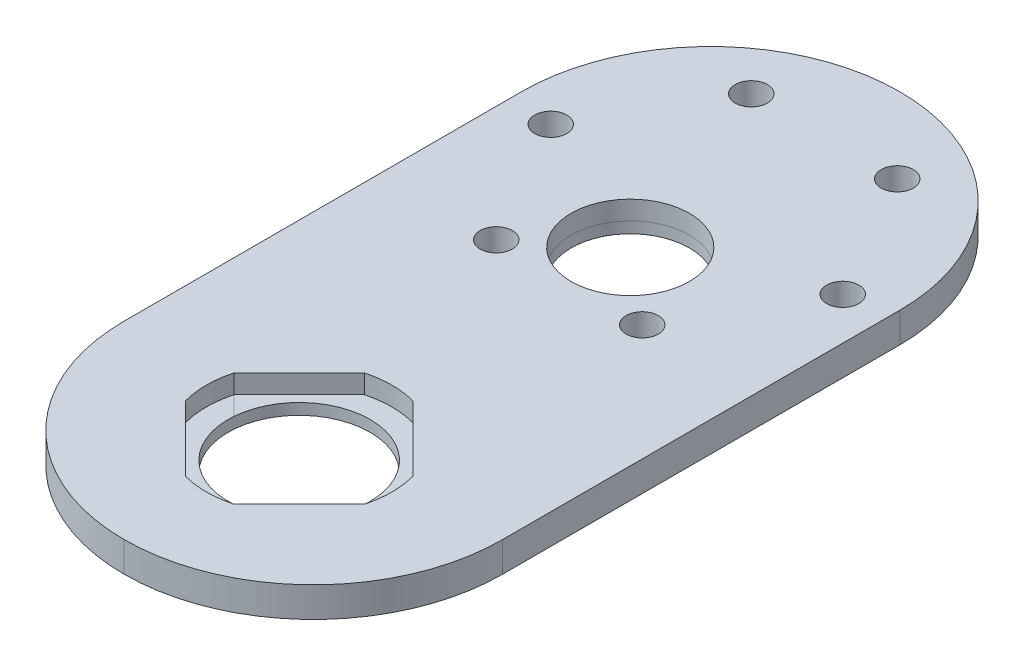
ISO-10303-21;
HEADER;
FILE_DESCRIPTION(('STEP AP214'),'2;1');
FILE_NAME('part.step','',(''),(''),'','','');
FILE_SCHEMA(('AUTOMOTIVE_DESIGN { 1 0 10303 214 1 1 1 1 }'));
ENDSEC;
DATA;
#1=APPLICATION_CONTEXT('core data for automotive mechanical design processes');
#2=APPLICATION_PROTOCOL_DEFINITION('international standard','automotive_design',2000,#1);
#3=PRODUCT_CONTEXT('',#1,'mechanical');
#4=PRODUCT('Part','Part','',(#3));
#5=PRODUCT_RELATED_PRODUCT_CATEGORY('part','',(#4));
#6=PRODUCT_DEFINITION_FORMATION('','',#4);
#7=PRODUCT_DEFINITION_CONTEXT('part definition',#1,'design');
#8=PRODUCT_DEFINITION('design','',#6,#7);
#9=PRODUCT_DEFINITION_SHAPE('','',#8);
#10=(LENGTH_UNIT() NAMED_UNIT(*) SI_UNIT(.MILLI.,.METRE.));
#11=(NAMED_UNIT(*) PLANE_ANGLE_UNIT() SI_UNIT($,.RADIAN.));
#12=(NAMED_UNIT(*) SI_UNIT($,.STERADIAN.) SOLID_ANGLE_UNIT());
#13=UNCERTAINTY_MEASURE_WITH_UNIT(LENGTH_MEASURE(1.E-05),#10,'distance_accuracy_value','');
#14=(GEOMETRIC_REPRESENTATION_CONTEXT(3) GLOBAL_UNCERTAINTY_ASSIGNED_CONTEXT((#13)) GLOBAL_UNIT_ASSIGNED_CONTEXT((#10,
#11,#12)) REPRESENTATION_CONTEXT('',''));
#15=CARTESIAN_POINT('',(0.,0.,0.));
#16=DIRECTION('',(0.,0.,1.));
#17=DIRECTION('',(1.,0.,0.));
#18=AXIS2_PLACEMENT_3D('',#15,#16,#17);
#19=CARTESIAN_POINT('',(0.,0.,0.));
#20=DIRECTION('',(0.,1.,0.));
#21=DIRECTION('',(0.,0.,1.));
#22=AXIS2_PLACEMENT_3D('',#19,#20,#21);
#23=PLANE('',#22);
#24=CARTESIAN_POINT('',(-33.1863924805896,0.,-17.3197798680824));
#25=DIRECTION('',(0.,-1.,0.));
#26=DIRECTION('',(0.,0.,-1.));
#27=AXIS2_PLACEMENT_3D('',#24,#25,#26);
#28=CIRCLE('',#27,1.69999999999999);
#29=CARTESIAN_POINT('',(-33.1863924805896,0.,-19.0197798680824));
#30=VERTEX_POINT('',#29);
#31=EDGE_CURVE('E210',#30,#30,#28,.T.);
#32=ORIENTED_EDGE('',*,*,#31,.T.);
#33=EDGE_LOOP('',(#32));
#34=FACE_BOUND('',#33,.T.);
#35=CARTESIAN_POINT('',(-40.9084819148407,0.,-23.7767003529734));
#36=DIRECTION('',(0.,1.,0.));
#37=DIRECTION('',(0.,0.,1.));
#38=AXIS2_PLACEMENT_3D('',#35,#36,#37);
#39=CIRCLE('',#38,6.25);
#40=CARTESIAN_POINT('',(-40.9084819148407,0.,-17.5267003529734));
#41=VERTEX_POINT('',#40);
#42=EDGE_CURVE('E165',#41,#41,#39,.T.);
#43=ORIENTED_EDGE('',*,*,#42,.F.);
#44=EDGE_LOOP('',(#43));
#45=FACE_BOUND('',#44,.T.);
#46=CARTESIAN_POINT('',(-40.9084819148407,0.,11.2232996470266));
#47=DIRECTION('',(0.,1.,0.));
#48=DIRECTION('',(0.,0.,1.));
#49=AXIS2_PLACEMENT_3D('',#46,#47,#48);
#50=CIRCLE('',#49,9.8);
#51=CARTESIAN_POINT('',(-50.3678024271225,0.,8.66180487913708));
#52=VERTEX_POINT('',#51);
#53=CARTESIAN_POINT('',(-50.3678024271225,0.,13.7847944149161));
#54=VERTEX_POINT('',#53);
#55=EDGE_CURVE('E230',#52,#54,#50,.T.);
#56=ORIENTED_EDGE('',*,*,#55,.F.);
#57=DIRECTION('',(-0.707106781186547,0.,0.707106781186548));
#58=VECTOR('',#57,1.);
#59=CARTESIAN_POINT('',(-43.4699766827303,0.,1.76397913474485));
#60=LINE('',#59,#58);
#61=CARTESIAN_POINT('',(-43.4699766827303,0.,1.76397913474485));
#62=VERTEX_POINT('',#61);
#63=EDGE_CURVE('E235',#62,#52,#60,.T.);
#64=ORIENTED_EDGE('',*,*,#63,.F.);
#65=CARTESIAN_POINT('',(-40.9084819148407,0.,11.2232996470266));
#66=DIRECTION('',(0.,1.,0.));
#67=DIRECTION('',(0.,0.,1.));
#68=AXIS2_PLACEMENT_3D('',#65,#66,#67);
#69=CIRCLE('',#68,9.80000000000001);
#70=CARTESIAN_POINT('',(-38.3469871469512,0.,1.76397913474484));
#71=VERTEX_POINT('',#70);
#72=EDGE_CURVE('E268',#71,#62,#69,.T.);
#73=ORIENTED_EDGE('',*,*,#72,.F.);
#74=DIRECTION('',(-0.707106781186548,0.,-0.707106781186547));
#75=VECTOR('',#74,1.);
#76=CARTESIAN_POINT('',(-31.4491614025589,0.,8.66180487913708));
#77=LINE('',#76,#75);
#78=CARTESIAN_POINT('',(-31.4491614025589,0.,8.66180487913708));
#79=VERTEX_POINT('',#78);
#80=EDGE_CURVE('E265',#79,#71,#77,.T.);
#81=ORIENTED_EDGE('',*,*,#80,.F.);
#82=CARTESIAN_POINT('',(-40.9084819148407,0.,11.2232996470266));
#83=DIRECTION('',(0.,1.,0.));
#84=DIRECTION('',(0.,0.,1.));
#85=AXIS2_PLACEMENT_3D('',#82,#83,#84);
#86=CIRCLE('',#85,9.80000000000001);
#87=CARTESIAN_POINT('',(-31.4491614025589,0.,13.7847944149161));
#88=VERTEX_POINT('',#87);
#89=EDGE_CURVE('E262',#88,#79,#86,.T.);
#90=ORIENTED_EDGE('',*,*,#89,.F.);
#91=DIRECTION('',(0.707106781186548,0.,-0.707106781186547));
#92=VECTOR('',#91,1.);
#93=CARTESIAN_POINT('',(-38.3469871469512,0.,20.6826201593084));
#94=LINE('',#93,#92);
#95=CARTESIAN_POINT('',(-38.3469871469512,0.,20.6826201593084));
#96=VERTEX_POINT('',#95);
#97=EDGE_CURVE('E259',#96,#88,#94,.T.);
#98=ORIENTED_EDGE('',*,*,#97,.F.);
#99=CARTESIAN_POINT('',(-40.9084819148407,0.,11.2232996470266));
#100=DIRECTION('',(0.,1.,0.));
#101=DIRECTION('',(0.,0.,1.));
#102=AXIS2_PLACEMENT_3D('',#99,#100,#101);
#103=CIRCLE('',#102,9.8);
#104=CARTESIAN_POINT('',(-43.4699766827303,0.,20.6826201593084));
#105=VERTEX_POINT('',#104);
#106=EDGE_CURVE('E256',#105,#96,#103,.T.);
#107=ORIENTED_EDGE('',*,*,#106,.F.);
#108=DIRECTION('',(0.707106781186547,0.,0.707106781186548));
#109=VECTOR('',#108,1.);
#110=CARTESIAN_POINT('',(-50.3678024271225,0.,13.7847944149162));
#111=LINE('',#110,#109);
#112=EDGE_CURVE('E253',#54,#105,#111,.T.);
#113=ORIENTED_EDGE('',*,*,#112,.F.);
#114=EDGE_LOOP('',(#56,#64,#73,#81,#90,#98,#107,#113));
#115=FACE_BOUND('',#114,.T.);
#116=CARTESIAN_POINT('',(-40.9084819148407,0.,-32.2767003529734));
#117=DIRECTION('',(0.,1.,0.));
#118=DIRECTION('',(0.,0.,1.));
#119=AXIS2_PLACEMENT_3D('',#116,#117,#118);
#120=CIRCLE('',#119,20.);
#121=CARTESIAN_POINT('',(-20.9084819148407,0.,-32.2767003529734));
#122=VERTEX_POINT('',#121);
#123=CARTESIAN_POINT('',(-40.9084819148407,0.,-52.2767003529734));
#124=VERTEX_POINT('',#123);
#125=EDGE_CURVE('E184',#122,#124,#120,.T.);
#126=ORIENTED_EDGE('',*,*,#125,.T.);
#127=CARTESIAN_POINT('',(-40.9084819148407,0.,-32.2767003529734));
#128=DIRECTION('',(0.,1.,0.));
#129=DIRECTION('',(0.,0.,1.));
#130=AXIS2_PLACEMENT_3D('',#127,#128,#129);
#131=CIRCLE('',#130,20.);
#132=CARTESIAN_POINT('',(-60.9084819148407,0.,-32.2767003529734));
#133=VERTEX_POINT('',#132);
#134=EDGE_CURVE('E186',#124,#133,#131,.T.);
#135=ORIENTED_EDGE('',*,*,#134,.T.);
#136=DIRECTION('',(0.,0.,1.));
#137=VECTOR('',#136,1.);
#138=CARTESIAN_POINT('',(-60.9084819148407,0.,-52.2767003529734));
#139=LINE('',#138,#137);
#140=CARTESIAN_POINT('',(-60.9084819148407,0.,9.72329964702663));
#141=VERTEX_POINT('',#140);
#142=EDGE_CURVE('E275',#133,#141,#139,.T.);
#143=ORIENTED_EDGE('',*,*,#142,.T.);
#144=CARTESIAN_POINT('',(-40.9084819148407,0.,9.72329964702663));
#145=DIRECTION('',(0.,1.,0.));
#146=DIRECTION('',(0.,0.,1.));
#147=AXIS2_PLACEMENT_3D('',#144,#145,#146);
#148=CIRCLE('',#147,20.);
#149=CARTESIAN_POINT('',(-40.9084819148407,0.,29.7232996470266));
#150=VERTEX_POINT('',#149);
#151=EDGE_CURVE('E156',#141,#150,#148,.T.);
#152=ORIENTED_EDGE('',*,*,#151,.T.);
#153=CARTESIAN_POINT('',(-40.9084819148407,0.,9.72329964702663));
#154=DIRECTION('',(0.,1.,0.));
#155=DIRECTION('',(0.,0.,1.));
#156=AXIS2_PLACEMENT_3D('',#153,#154,#155);
#157=CIRCLE('',#156,20.);
#158=CARTESIAN_POINT('',(-20.9084819148407,0.,9.72329964702663));
#159=VERTEX_POINT('',#158);
#160=EDGE_CURVE('E182',#150,#159,#157,.T.);
#161=ORIENTED_EDGE('',*,*,#160,.T.);
#162=DIRECTION('',(0.,0.,-1.));
#163=VECTOR('',#162,1.);
#164=CARTESIAN_POINT('',(-20.9084819148407,0.,-52.2767003529734));
#165=LINE('',#164,#163);
#166=EDGE_CURVE('E178',#159,#122,#165,.T.);
#167=ORIENTED_EDGE('',*,*,#166,.T.);
#168=EDGE_LOOP('',(#126,#135,#143,#152,#161,#167));
#169=FACE_BOUND('',#168,.T.);
#170=CARTESIAN_POINT('',(-25.3782907866334,0.,-30.7094605191226));
#171=DIRECTION('',(0.,-1.,0.));
#172=DIRECTION('',(0.,0.,-1.));
#173=AXIS2_PLACEMENT_3D('',#170,#171,#172);
#174=CIRCLE('',#173,1.69999999999999);
#175=CARTESIAN_POINT('',(-25.3782907866334,0.,-32.4094605191226));
#176=VERTEX_POINT('',#175);
#177=EDGE_CURVE('E220',#176,#176,#174,.T.);
#178=ORIENTED_EDGE('',*,*,#177,.T.);
#179=EDGE_LOOP('',(#178));
#180=FACE_BOUND('',#179,.T.);
#181=CARTESIAN_POINT('',(-33.0700435320169,0.,-44.1663152669411));
#182=DIRECTION('',(0.,-1.,0.));
#183=DIRECTION('',(0.,0.,-1.));
#184=AXIS2_PLACEMENT_3D('',#181,#182,#183);
#185=CIRCLE('',#184,1.69999999999999);
#186=CARTESIAN_POINT('',(-33.0700435320169,0.,-45.8663152669411));
#187=VERTEX_POINT('',#186);
#188=EDGE_CURVE('E597',#187,#187,#185,.T.);
#189=ORIENTED_EDGE('',*,*,#188,.T.);
#190=EDGE_LOOP('',(#189));
#191=FACE_BOUND('',#190,.T.);
#192=CARTESIAN_POINT('',(-48.6862469199294,0.,-17.3869539648608));
#193=DIRECTION('',(0.,-1.,0.));
#194=DIRECTION('',(0.,0.,-1.));
#195=AXIS2_PLACEMENT_3D('',#192,#193,#194);
#196=CIRCLE('',#195,1.69999999999999);
#197=CARTESIAN_POINT('',(-48.6862469199294,0.,-19.0869539648608));
#198=VERTEX_POINT('',#197);
#199=EDGE_CURVE('E591',#198,#198,#196,.T.);
#200=ORIENTED_EDGE('',*,*,#199,.T.);
#201=EDGE_LOOP('',(#200));
#202=FACE_BOUND('',#201,.T.);
#203=CARTESIAN_POINT('',(-48.5698979713568,0.,-44.2334893637194));
#204=DIRECTION('',(0.,-1.,0.));
#205=DIRECTION('',(0.,0.,-1.));
#206=AXIS2_PLACEMENT_3D('',#203,#204,#205);
#207=CIRCLE('',#206,1.69999999999999);
#208=CARTESIAN_POINT('',(-48.5698979713568,0.,-45.9334893637194));
#209=VERTEX_POINT('',#208);
#210=EDGE_CURVE('E585',#209,#209,#207,.T.);
#211=ORIENTED_EDGE('',*,*,#210,.T.);
#212=EDGE_LOOP('',(#211));
#213=FACE_BOUND('',#212,.T.);
#214=CARTESIAN_POINT('',(-56.377999665313,0.,-30.8438087126793));
#215=DIRECTION('',(0.,-1.,0.));
#216=DIRECTION('',(0.,0.,-1.));
#217=AXIS2_PLACEMENT_3D('',#214,#215,#216);
#218=CIRCLE('',#217,1.69999999999999);
#219=CARTESIAN_POINT('',(-56.377999665313,0.,-32.5438087126793));
#220=VERTEX_POINT('',#219);
#221=EDGE_CURVE('E576',#220,#220,#218,.T.);
#222=ORIENTED_EDGE('',*,*,#221,.T.);
#223=EDGE_LOOP('',(#222));
#224=FACE_BOUND('',#223,.T.);
#225=ADVANCED_FACE('F42',(#34,#45,#115,#169,#180,#191,#202,#213,#224),#23,.T.);
#226=CARTESIAN_POINT('',(-40.9084819148407,-2.,11.2232996470266));
#227=DIRECTION('',(0.,1.,0.));
#228=DIRECTION('',(0.,0.,1.));
#229=AXIS2_PLACEMENT_3D('',#226,#227,#228);
#230=PLANE('',#229);
#231=CARTESIAN_POINT('',(-40.9084819148407,-2.,11.2232996470266));
#232=DIRECTION('',(0.,1.,0.));
#233=DIRECTION('',(0.,0.,1.));
#234=AXIS2_PLACEMENT_3D('',#231,#232,#233);
#235=CIRCLE('',#234,7.5);
#236=CARTESIAN_POINT('',(-40.3287473713401,-2.,18.7008599349195));
#237=VERTEX_POINT('',#236);
#238=CARTESIAN_POINT('',(-48.3860422027336,-2.,10.643565103526));
#239=VERTEX_POINT('',#238);
#240=EDGE_CURVE('E152',#237,#239,#235,.T.);
#241=ORIENTED_EDGE('',*,*,#240,.F.);
#242=DIRECTION('',(0.707106781186547,0.,0.707106781186548));
#243=VECTOR('',#242,1.);
#244=CARTESIAN_POINT('',(-50.3678024271225,-2.,8.66180487913708));
#245=LINE('',#244,#243);
#246=CARTESIAN_POINT('',(-38.3469871469512,-2.,20.6826201593084));
#247=VERTEX_POINT('',#246);
#248=EDGE_CURVE('E162',#237,#247,#245,.T.);
#249=ORIENTED_EDGE('',*,*,#248,.T.);
#250=DIRECTION('',(0.707106781186548,0.,-0.707106781186547));
#251=VECTOR('',#250,1.);
#252=CARTESIAN_POINT('',(-38.3469871469512,-2.,20.6826201593084));
#253=LINE('',#252,#251);
#254=CARTESIAN_POINT('',(-31.4491614025589,-2.,13.7847944149161));
#255=VERTEX_POINT('',#254);
#256=EDGE_CURVE('E238',#247,#255,#253,.T.);
#257=ORIENTED_EDGE('',*,*,#256,.T.);
#258=CARTESIAN_POINT('',(-40.9084819148407,-2.,11.2232996470266));
#259=DIRECTION('',(0.,1.,0.));
#260=DIRECTION('',(0.,0.,1.));
#261=AXIS2_PLACEMENT_3D('',#258,#259,#260);
#262=CIRCLE('',#261,9.80000000000001);
#263=CARTESIAN_POINT('',(-31.4491614025589,-2.,8.66180487913708));
#264=VERTEX_POINT('',#263);
#265=EDGE_CURVE('E240',#255,#264,#262,.T.);
#266=ORIENTED_EDGE('',*,*,#265,.T.);
#267=DIRECTION('',(-0.707106781186548,0.,-0.707106781186547));
#268=VECTOR('',#267,1.);
#269=CARTESIAN_POINT('',(-31.4491614025589,-2.,8.66180487913708));
#270=LINE('',#269,#268);
#271=CARTESIAN_POINT('',(-38.3469871469512,-2.,1.76397913474484));
#272=VERTEX_POINT('',#271);
#273=EDGE_CURVE('E243',#264,#272,#270,.T.);
#274=ORIENTED_EDGE('',*,*,#273,.T.);
#275=CARTESIAN_POINT('',(-40.9084819148407,-2.,11.2232996470266));
#276=DIRECTION('',(0.,1.,0.));
#277=DIRECTION('',(0.,0.,1.));
#278=AXIS2_PLACEMENT_3D('',#275,#276,#277);
#279=CIRCLE('',#278,9.80000000000001);
#280=CARTESIAN_POINT('',(-43.4699766827303,-2.,1.76397913474485));
#281=VERTEX_POINT('',#280);
#282=EDGE_CURVE('E246',#272,#281,#279,.T.);
#283=ORIENTED_EDGE('',*,*,#282,.T.);
#284=DIRECTION('',(-0.707106781186547,0.,0.707106781186548));
#285=VECTOR('',#284,1.);
#286=CARTESIAN_POINT('',(-43.4699766827303,-2.,1.76397913474485));
#287=LINE('',#286,#285);
#288=CARTESIAN_POINT('',(-50.3678024271225,-2.,8.66180487913708));
#289=VERTEX_POINT('',#288);
#290=EDGE_CURVE('E249',#281,#289,#287,.T.);
#291=ORIENTED_EDGE('',*,*,#290,.T.);
#292=EDGE_CURVE('E157',#289,#239,#245,.T.);
#293=ORIENTED_EDGE('',*,*,#292,.T.);
#294=EDGE_LOOP('',(#241,#249,#257,#266,#274,#283,#291,#293));
#295=FACE_BOUND('',#294,.T.);
#296=ADVANCED_FACE('F160',(#295),#230,.T.);
#297=CARTESIAN_POINT('',(-60.9084819148407,-3.175,-52.2767003529734));
#298=DIRECTION('',(-1.,0.,0.));
#299=DIRECTION('',(0.,0.,1.));
#300=AXIS2_PLACEMENT_3D('',#297,#298,#299);
#301=PLANE('',#300);
#302=ORIENTED_EDGE('',*,*,#142,.F.);
#303=DIRECTION('',(0.,1.,0.));
#304=VECTOR('',#303,1.);
#305=CARTESIAN_POINT('',(-60.9084819148407,-3.175,-32.2767003529734));
#306=LINE('',#305,#304);
#307=CARTESIAN_POINT('',(-60.9084819148407,-3.175,-32.2767003529734));
#308=VERTEX_POINT('',#307);
#309=EDGE_CURVE('E190',#133,#308,#306,.F.);
#310=ORIENTED_EDGE('',*,*,#309,.T.);
#311=DIRECTION('',(0.,0.,1.));
#312=VECTOR('',#311,1.);
#313=CARTESIAN_POINT('',(-60.9084819148407,-3.175,-52.2767003529734));
#314=LINE('',#313,#312);
#315=CARTESIAN_POINT('',(-60.9084819148407,-3.175,9.72329964702663));
#316=VERTEX_POINT('',#315);
#317=EDGE_CURVE('E175',#308,#316,#314,.T.);
#318=ORIENTED_EDGE('',*,*,#317,.T.);
#319=DIRECTION('',(0.,1.,0.));
#320=VECTOR('',#319,1.);
#321=CARTESIAN_POINT('',(-60.9084819148407,-3.175,9.72329964702663));
#322=LINE('',#321,#320);
#323=EDGE_CURVE('E188',#316,#141,#322,.T.);
#324=ORIENTED_EDGE('',*,*,#323,.T.);
#325=EDGE_LOOP('',(#302,#310,#318,#324));
#326=FACE_BOUND('',#325,.T.);
#327=ADVANCED_FACE('F307',(#326),#301,.T.);
#328=CARTESIAN_POINT('',(-20.9084819148407,-3.175,-52.2767003529734));
#329=DIRECTION('',(1.,0.,0.));
#330=DIRECTION('',(0.,0.,-1.));
#331=AXIS2_PLACEMENT_3D('',#328,#329,#330);
#332=PLANE('',#331);
#333=DIRECTION('',(0.,0.,-1.));
#334=VECTOR('',#333,1.);
#335=CARTESIAN_POINT('',(-20.9084819148407,-3.175,-52.2767003529734));
#336=LINE('',#335,#334);
#337=CARTESIAN_POINT('',(-20.9084819148407,-3.175,9.72329964702663));
#338=VERTEX_POINT('',#337);
#339=CARTESIAN_POINT('',(-20.9084819148407,-3.175,-32.2767003529734));
#340=VERTEX_POINT('',#339);
#341=EDGE_CURVE('E173',#338,#340,#336,.T.);
#342=ORIENTED_EDGE('',*,*,#341,.T.);
#343=DIRECTION('',(0.,1.,0.));
#344=VECTOR('',#343,1.);
#345=CARTESIAN_POINT('',(-20.9084819148407,-3.175,-32.2767003529734));
#346=LINE('',#345,#344);
#347=EDGE_CURVE('E12',#340,#122,#346,.T.);
#348=ORIENTED_EDGE('',*,*,#347,.T.);
#349=ORIENTED_EDGE('',*,*,#166,.F.);
#350=DIRECTION('',(0.,1.,0.));
#351=VECTOR('',#350,1.);
#352=CARTESIAN_POINT('',(-20.9084819148407,-3.175,9.72329964702663));
#353=LINE('',#352,#351);
#354=EDGE_CURVE('E51',#159,#338,#353,.F.);
#355=ORIENTED_EDGE('',*,*,#354,.T.);
#356=EDGE_LOOP('',(#342,#348,#349,#355));
#357=FACE_BOUND('',#356,.T.);
#358=ADVANCED_FACE('F312',(#357),#332,.T.);
#359=CARTESIAN_POINT('',(0.,-3.175,0.));
#360=DIRECTION('',(0.,1.,0.));
#361=DIRECTION('',(0.,0.,1.));
#362=AXIS2_PLACEMENT_3D('',#359,#360,#361);
#363=PLANE('',#362);
#364=CARTESIAN_POINT('',(-56.377999665313,-3.175,-30.8438087126793));
#365=DIRECTION('',(0.,-1.,0.));
#366=DIRECTION('',(0.,0.,-1.));
#367=AXIS2_PLACEMENT_3D('',#364,#365,#366);
#368=CIRCLE('',#367,1.69999999999999);
#369=CARTESIAN_POINT('',(-56.377999665313,-3.175,-32.5438087126793));
#370=VERTEX_POINT('',#369);
#371=EDGE_CURVE('E578',#370,#370,#368,.T.);
#372=ORIENTED_EDGE('',*,*,#371,.F.);
#373=EDGE_LOOP('',(#372));
#374=FACE_BOUND('',#373,.T.);
#375=CARTESIAN_POINT('',(-48.5698979713568,-3.175,-44.2334893637194));
#376=DIRECTION('',(0.,-1.,0.));
#377=DIRECTION('',(0.,0.,-1.));
#378=AXIS2_PLACEMENT_3D('',#375,#376,#377);
#379=CIRCLE('',#378,1.69999999999999);
#380=CARTESIAN_POINT('',(-48.5698979713568,-3.175,-45.9334893637194));
#381=VERTEX_POINT('',#380);
#382=EDGE_CURVE('E580',#381,#381,#379,.T.);
#383=ORIENTED_EDGE('',*,*,#382,.F.);
#384=EDGE_LOOP('',(#383));
#385=FACE_BOUND('',#384,.T.);
#386=CARTESIAN_POINT('',(-48.6862469199294,-3.175,-17.3869539648608));
#387=DIRECTION('',(0.,-1.,0.));
#388=DIRECTION('',(0.,0.,-1.));
#389=AXIS2_PLACEMENT_3D('',#386,#387,#388);
#390=CIRCLE('',#389,1.69999999999999);
#391=CARTESIAN_POINT('',(-48.6862469199294,-3.175,-19.0869539648608));
#392=VERTEX_POINT('',#391);
#393=EDGE_CURVE('E588',#392,#392,#390,.T.);
#394=ORIENTED_EDGE('',*,*,#393,.F.);
#395=EDGE_LOOP('',(#394));
#396=FACE_BOUND('',#395,.T.);
#397=CARTESIAN_POINT('',(-33.0700435320169,-3.175,-44.1663152669411));
#398=DIRECTION('',(0.,-1.,0.));
#399=DIRECTION('',(0.,0.,-1.));
#400=AXIS2_PLACEMENT_3D('',#397,#398,#399);
#401=CIRCLE('',#400,1.69999999999999);
#402=CARTESIAN_POINT('',(-33.0700435320169,-3.175,-45.8663152669411));
#403=VERTEX_POINT('',#402);
#404=EDGE_CURVE('E594',#403,#403,#401,.T.);
#405=ORIENTED_EDGE('',*,*,#404,.F.);
#406=EDGE_LOOP('',(#405));
#407=FACE_BOUND('',#406,.T.);
#408=CARTESIAN_POINT('',(-25.3782907866334,-3.175,-30.7094605191226));
#409=DIRECTION('',(0.,-1.,0.));
#410=DIRECTION('',(0.,0.,-1.));
#411=AXIS2_PLACEMENT_3D('',#408,#409,#410);
#412=CIRCLE('',#411,1.69999999999999);
#413=CARTESIAN_POINT('',(-25.3782907866334,-3.175,-32.4094605191226));
#414=VERTEX_POINT('',#413);
#415=EDGE_CURVE('E600',#414,#414,#412,.T.);
#416=ORIENTED_EDGE('',*,*,#415,.F.);
#417=EDGE_LOOP('',(#416));
#418=FACE_BOUND('',#417,.T.);
#419=CARTESIAN_POINT('',(-33.1863924805896,-3.175,-17.3197798680824));
#420=DIRECTION('',(0.,-1.,0.));
#421=DIRECTION('',(0.,0.,-1.));
#422=AXIS2_PLACEMENT_3D('',#419,#420,#421);
#423=CIRCLE('',#422,1.69999999999999);
#424=CARTESIAN_POINT('',(-33.1863924805896,-3.175,-19.0197798680824));
#425=VERTEX_POINT('',#424);
#426=EDGE_CURVE('E215',#425,#425,#423,.T.);
#427=ORIENTED_EDGE('',*,*,#426,.F.);
#428=EDGE_LOOP('',(#427));
#429=FACE_BOUND('',#428,.T.);
#430=CARTESIAN_POINT('',(-40.9084819148407,-3.175,-23.7767003529734));
#431=DIRECTION('',(0.,-1.,0.));
#432=DIRECTION('',(0.,0.,-1.));
#433=AXIS2_PLACEMENT_3D('',#430,#431,#432);
#434=CIRCLE('',#433,6.25);
#435=CARTESIAN_POINT('',(-40.9084819148407,-3.175,-30.0267003529734));
#436=VERTEX_POINT('',#435);
#437=EDGE_CURVE('E202',#436,#436,#434,.T.);
#438=ORIENTED_EDGE('',*,*,#437,.F.);
#439=EDGE_LOOP('',(#438));
#440=FACE_BOUND('',#439,.T.);
#441=CARTESIAN_POINT('',(-40.9084819148407,-3.175,11.2232996470266));
#442=DIRECTION('',(0.,-1.,0.));
#443=DIRECTION('',(0.,0.,-1.));
#444=AXIS2_PLACEMENT_3D('',#441,#442,#443);
#445=CIRCLE('',#444,7.5);
#446=CARTESIAN_POINT('',(-40.9084819148407,-3.175,3.72329964702662));
#447=VERTEX_POINT('',#446);
#448=EDGE_CURVE('E166',#447,#447,#445,.T.);
#449=ORIENTED_EDGE('',*,*,#448,.F.);
#450=EDGE_LOOP('',(#449));
#451=FACE_BOUND('',#450,.T.);
#452=ORIENTED_EDGE('',*,*,#317,.F.);
#453=CARTESIAN_POINT('',(-40.9084819148407,-3.175,-32.2767003529734));
#454=DIRECTION('',(0.,1.,0.));
#455=DIRECTION('',(0.,0.,1.));
#456=AXIS2_PLACEMENT_3D('',#453,#454,#455);
#457=CIRCLE('',#456,20.);
#458=CARTESIAN_POINT('',(-40.9084819148407,-3.175,-52.2767003529734));
#459=VERTEX_POINT('',#458);
#460=EDGE_CURVE('E197',#308,#459,#457,.F.);
#461=ORIENTED_EDGE('',*,*,#460,.T.);
#462=CARTESIAN_POINT('',(-40.9084819148407,-3.175,-32.2767003529734));
#463=DIRECTION('',(0.,1.,0.));
#464=DIRECTION('',(0.,0.,1.));
#465=AXIS2_PLACEMENT_3D('',#462,#463,#464);
#466=CIRCLE('',#465,20.);
#467=EDGE_CURVE('E65',#459,#340,#466,.F.);
#468=ORIENTED_EDGE('',*,*,#467,.T.);
#469=ORIENTED_EDGE('',*,*,#341,.F.);
#470=CARTESIAN_POINT('',(-40.9084819148407,-3.175,9.72329964702663));
#471=DIRECTION('',(0.,1.,0.));
#472=DIRECTION('',(0.,0.,1.));
#473=AXIS2_PLACEMENT_3D('',#470,#471,#472);
#474=CIRCLE('',#473,20.);
#475=CARTESIAN_POINT('',(-40.9084819148407,-3.175,29.7232996470266));
#476=VERTEX_POINT('',#475);
#477=EDGE_CURVE('E59',#338,#476,#474,.F.);
#478=ORIENTED_EDGE('',*,*,#477,.T.);
#479=CARTESIAN_POINT('',(-40.9084819148407,-3.175,9.72329964702663));
#480=DIRECTION('',(0.,1.,0.));
#481=DIRECTION('',(0.,0.,1.));
#482=AXIS2_PLACEMENT_3D('',#479,#480,#481);
#483=CIRCLE('',#482,20.);
#484=EDGE_CURVE('E193',#476,#316,#483,.F.);
#485=ORIENTED_EDGE('',*,*,#484,.T.);
#486=EDGE_LOOP('',(#452,#461,#468,#469,#478,#485));
#487=FACE_BOUND('',#486,.T.);
#488=ADVANCED_FACE('F313',(#374,#385,#396,#407,#418,#429,#440,#451,#487),#363,.F.);
#489=CARTESIAN_POINT('',(-40.9084819148407,-2.,11.2232996470266));
#490=DIRECTION('',(0.,1.,0.));
#491=DIRECTION('',(0.,0.,1.));
#492=AXIS2_PLACEMENT_3D('',#489,#490,#491);
#493=CYLINDRICAL_SURFACE('',#492,9.8);
#494=ORIENTED_EDGE('',*,*,#55,.T.);
#495=DIRECTION('',(0.,1.,0.));
#496=VECTOR('',#495,1.);
#497=CARTESIAN_POINT('',(-50.3678024271225,-2.,13.7847944149162));
#498=LINE('',#497,#496);
#499=CARTESIAN_POINT('',(-50.3678024271225,-2.,13.7847944149162));
#500=VERTEX_POINT('',#499);
#501=EDGE_CURVE('E251',#500,#54,#498,.T.);
#502=ORIENTED_EDGE('',*,*,#501,.F.);
#503=CARTESIAN_POINT('',(-40.9084819148407,-2.,11.2232996470266));
#504=DIRECTION('',(0.,1.,0.));
#505=DIRECTION('',(0.,0.,1.));
#506=AXIS2_PLACEMENT_3D('',#503,#504,#505);
#507=CIRCLE('',#506,9.8);
#508=EDGE_CURVE('E231',#289,#500,#507,.T.);
#509=ORIENTED_EDGE('',*,*,#508,.F.);
#510=DIRECTION('',(0.,1.,0.));
#511=VECTOR('',#510,1.);
#512=CARTESIAN_POINT('',(-50.3678024271225,-2.,8.66180487913708));
#513=LINE('',#512,#511);
#514=EDGE_CURVE('E273',#289,#52,#513,.T.);
#515=ORIENTED_EDGE('',*,*,#514,.T.);
#516=EDGE_LOOP('',(#494,#502,#509,#515));
#517=FACE_BOUND('',#516,.T.);
#518=ADVANCED_FACE('F315',(#517),#493,.F.);
#519=CARTESIAN_POINT('',(-43.4699766827303,-2.,1.76397913474485));
#520=DIRECTION('',(-0.707106781186548,0.,-0.707106781186547));
#521=DIRECTION('',(-0.707106781186547,0.,0.707106781186548));
#522=AXIS2_PLACEMENT_3D('',#519,#520,#521);
#523=PLANE('',#522);
#524=ORIENTED_EDGE('',*,*,#63,.T.);
#525=ORIENTED_EDGE('',*,*,#514,.F.);
#526=ORIENTED_EDGE('',*,*,#290,.F.);
#527=DIRECTION('',(0.,1.,0.));
#528=VECTOR('',#527,1.);
#529=CARTESIAN_POINT('',(-43.4699766827303,-2.,1.76397913474485));
#530=LINE('',#529,#528);
#531=EDGE_CURVE('E276',#281,#62,#530,.T.);
#532=ORIENTED_EDGE('',*,*,#531,.T.);
#533=EDGE_LOOP('',(#524,#525,#526,#532));
#534=FACE_BOUND('',#533,.T.);
#535=ADVANCED_FACE('F322',(#534),#523,.F.);
#536=CARTESIAN_POINT('',(-40.9084819148407,-2.,11.2232996470266));
#537=DIRECTION('',(0.,1.,0.));
#538=DIRECTION('',(0.,0.,1.));
#539=AXIS2_PLACEMENT_3D('',#536,#537,#538);
#540=CYLINDRICAL_SURFACE('',#539,9.80000000000001);
#541=ORIENTED_EDGE('',*,*,#72,.T.);
#542=ORIENTED_EDGE('',*,*,#531,.F.);
#543=ORIENTED_EDGE('',*,*,#282,.F.);
#544=DIRECTION('',(0.,1.,0.));
#545=VECTOR('',#544,1.);
#546=CARTESIAN_POINT('',(-38.3469871469512,-2.,1.76397913474484));
#547=LINE('',#546,#545);
#548=EDGE_CURVE('E278',#272,#71,#547,.T.);
#549=ORIENTED_EDGE('',*,*,#548,.T.);
#550=EDGE_LOOP('',(#541,#542,#543,#549));
#551=FACE_BOUND('',#550,.T.);
#552=ADVANCED_FACE('F429',(#551),#540,.F.);
#553=CARTESIAN_POINT('',(-31.4491614025589,-2.,8.66180487913708));
#554=DIRECTION('',(0.707106781186547,0.,-0.707106781186548));
#555=DIRECTION('',(-0.707106781186548,0.,-0.707106781186547));
#556=AXIS2_PLACEMENT_3D('',#553,#554,#555);
#557=PLANE('',#556);
#558=ORIENTED_EDGE('',*,*,#80,.T.);
#559=ORIENTED_EDGE('',*,*,#548,.F.);
#560=ORIENTED_EDGE('',*,*,#273,.F.);
#561=DIRECTION('',(0.,1.,0.));
#562=VECTOR('',#561,1.);
#563=CARTESIAN_POINT('',(-31.4491614025589,-2.,8.66180487913708));
#564=LINE('',#563,#562);
#565=EDGE_CURVE('E280',#264,#79,#564,.T.);
#566=ORIENTED_EDGE('',*,*,#565,.T.);
#567=EDGE_LOOP('',(#558,#559,#560,#566));
#568=FACE_BOUND('',#567,.T.);
#569=ADVANCED_FACE('F421',(#568),#557,.F.);
#570=CARTESIAN_POINT('',(-40.9084819148407,-2.,11.2232996470266));
#571=DIRECTION('',(0.,1.,0.));
#572=DIRECTION('',(0.,0.,1.));
#573=AXIS2_PLACEMENT_3D('',#570,#571,#572);
#574=CYLINDRICAL_SURFACE('',#573,9.80000000000001);
#575=ORIENTED_EDGE('',*,*,#89,.T.);
#576=ORIENTED_EDGE('',*,*,#565,.F.);
#577=ORIENTED_EDGE('',*,*,#265,.F.);
#578=DIRECTION('',(0.,1.,0.));
#579=VECTOR('',#578,1.);
#580=CARTESIAN_POINT('',(-31.4491614025589,-2.,13.7847944149161));
#581=LINE('',#580,#579);
#582=EDGE_CURVE('E282',#255,#88,#581,.T.);
#583=ORIENTED_EDGE('',*,*,#582,.T.);
#584=EDGE_LOOP('',(#575,#576,#577,#583));
#585=FACE_BOUND('',#584,.T.);
#586=ADVANCED_FACE('F413',(#585),#574,.F.);
#587=CARTESIAN_POINT('',(-38.3469871469512,-2.,20.6826201593084));
#588=DIRECTION('',(0.707106781186547,0.,0.707106781186548));
#589=DIRECTION('',(0.707106781186548,0.,-0.707106781186547));
#590=AXIS2_PLACEMENT_3D('',#587,#588,#589);
#591=PLANE('',#590);
#592=ORIENTED_EDGE('',*,*,#97,.T.);
#593=ORIENTED_EDGE('',*,*,#582,.F.);
#594=ORIENTED_EDGE('',*,*,#256,.F.);
#595=DIRECTION('',(0.,1.,0.));
#596=VECTOR('',#595,1.);
#597=CARTESIAN_POINT('',(-38.3469871469512,-2.,20.6826201593084));
#598=LINE('',#597,#596);
#599=EDGE_CURVE('E284',#247,#96,#598,.T.);
#600=ORIENTED_EDGE('',*,*,#599,.T.);
#601=EDGE_LOOP('',(#592,#593,#594,#600));
#602=FACE_BOUND('',#601,.T.);
#603=ADVANCED_FACE('F405',(#602),#591,.F.);
#604=CARTESIAN_POINT('',(-40.9084819148407,-2.,11.2232996470266));
#605=DIRECTION('',(0.,1.,0.));
#606=DIRECTION('',(0.,0.,1.));
#607=AXIS2_PLACEMENT_3D('',#604,#605,#606);
#608=CYLINDRICAL_SURFACE('',#607,9.8);
#609=ORIENTED_EDGE('',*,*,#106,.T.);
#610=ORIENTED_EDGE('',*,*,#599,.F.);
#611=CARTESIAN_POINT('',(-40.9084819148407,-2.,11.2232996470266));
#612=DIRECTION('',(0.,1.,0.));
#613=DIRECTION('',(0.,0.,1.));
#614=AXIS2_PLACEMENT_3D('',#611,#612,#613);
#615=CIRCLE('',#614,9.8);
#616=CARTESIAN_POINT('',(-43.4699766827303,-2.,20.6826201593084));
#617=VERTEX_POINT('',#616);
#618=EDGE_CURVE('E172',#617,#247,#615,.T.);
#619=ORIENTED_EDGE('',*,*,#618,.F.);
#620=DIRECTION('',(0.,1.,0.));
#621=VECTOR('',#620,1.);
#622=CARTESIAN_POINT('',(-43.4699766827303,-2.,20.6826201593084));
#623=LINE('',#622,#621);
#624=EDGE_CURVE('E286',#617,#105,#623,.T.);
#625=ORIENTED_EDGE('',*,*,#624,.T.);
#626=EDGE_LOOP('',(#609,#610,#619,#625));
#627=FACE_BOUND('',#626,.T.);
#628=ADVANCED_FACE('F397',(#627),#608,.F.);
#629=CARTESIAN_POINT('',(-50.3678024271225,-2.,13.7847944149162));
#630=DIRECTION('',(-0.707106781186548,0.,0.707106781186547));
#631=DIRECTION('',(0.707106781186547,0.,0.707106781186548));
#632=AXIS2_PLACEMENT_3D('',#629,#630,#631);
#633=PLANE('',#632);
#634=ORIENTED_EDGE('',*,*,#112,.T.);
#635=ORIENTED_EDGE('',*,*,#624,.F.);
#636=DIRECTION('',(0.707106781186547,0.,0.707106781186548));
#637=VECTOR('',#636,1.);
#638=CARTESIAN_POINT('',(-50.3678024271225,-2.,13.7847944149162));
#639=LINE('',#638,#637);
#640=EDGE_CURVE('E234',#500,#617,#639,.T.);
#641=ORIENTED_EDGE('',*,*,#640,.F.);
#642=ORIENTED_EDGE('',*,*,#501,.T.);
#643=EDGE_LOOP('',(#634,#635,#641,#642));
#644=FACE_BOUND('',#643,.T.);
#645=ADVANCED_FACE('F392',(#644),#633,.F.);
#646=CARTESIAN_POINT('',(-40.9084819148407,-2.,11.2232996470266));
#647=DIRECTION('',(0.,1.,0.));
#648=DIRECTION('',(0.,0.,1.));
#649=AXIS2_PLACEMENT_3D('',#646,#647,#648);
#650=CIRCLE('',#649,7.5);
#651=EDGE_CURVE('E148',#239,#237,#650,.T.);
#652=ORIENTED_EDGE('',*,*,#651,.F.);
#653=ORIENTED_EDGE('',*,*,#292,.F.);
#654=ORIENTED_EDGE('',*,*,#508,.T.);
#655=ORIENTED_EDGE('',*,*,#640,.T.);
#656=ORIENTED_EDGE('',*,*,#618,.T.);
#657=ORIENTED_EDGE('',*,*,#248,.F.);
#658=EDGE_LOOP('',(#652,#653,#654,#655,#656,#657));
#659=FACE_BOUND('',#658,.T.);
#660=ADVANCED_FACE('F169',(#659),#230,.T.);
#661=CARTESIAN_POINT('',(-40.9084819148407,-2.,-23.7767003529734));
#662=DIRECTION('',(0.,1.,0.));
#663=DIRECTION('',(0.,0.,1.));
#664=AXIS2_PLACEMENT_3D('',#661,#662,#663);
#665=CYLINDRICAL_SURFACE('',#664,6.25);
#666=CARTESIAN_POINT('',(-40.9084819148407,-2.,-23.7767003529734));
#667=DIRECTION('',(0.,1.,0.));
#668=DIRECTION('',(0.,0.,1.));
#669=AXIS2_PLACEMENT_3D('',#666,#667,#668);
#670=CIRCLE('',#669,6.25);
#671=CARTESIAN_POINT('',(-40.9084819148407,-2.,-17.5267003529734));
#672=VERTEX_POINT('',#671);
#673=EDGE_CURVE('E207',#672,#672,#670,.T.);
#674=ORIENTED_EDGE('',*,*,#673,.F.);
#675=EDGE_LOOP('',(#674));
#676=FACE_BOUND('',#675,.T.);
#677=ORIENTED_EDGE('',*,*,#42,.T.);
#678=EDGE_LOOP('',(#677));
#679=FACE_BOUND('',#678,.T.);
#680=ADVANCED_FACE('F376',(#676,#679),#665,.F.);
#681=CARTESIAN_POINT('',(-40.9084819148407,6.825,11.2232996470266));
#682=DIRECTION('',(0.,-1.,0.));
#683=DIRECTION('',(0.,0.,-1.));
#684=AXIS2_PLACEMENT_3D('',#681,#682,#683);
#685=CYLINDRICAL_SURFACE('',#684,7.5);
#686=ORIENTED_EDGE('',*,*,#240,.T.);
#687=ORIENTED_EDGE('',*,*,#651,.T.);
#688=EDGE_LOOP('',(#686,#687));
#689=FACE_BOUND('',#688,.T.);
#690=ORIENTED_EDGE('',*,*,#448,.T.);
#691=EDGE_LOOP('',(#690));
#692=FACE_BOUND('',#691,.T.);
#693=ADVANCED_FACE('F150',(#689,#692),#685,.F.);
#694=CARTESIAN_POINT('',(-40.9084819148407,6.825,-23.7767003529734));
#695=DIRECTION('',(0.,-1.,0.));
#696=DIRECTION('',(0.,0.,-1.));
#697=AXIS2_PLACEMENT_3D('',#694,#695,#696);
#698=CYLINDRICAL_SURFACE('',#697,6.25);
#699=ORIENTED_EDGE('',*,*,#673,.T.);
#700=EDGE_LOOP('',(#699));
#701=FACE_BOUND('',#700,.T.);
#702=ORIENTED_EDGE('',*,*,#437,.T.);
#703=EDGE_LOOP('',(#702));
#704=FACE_BOUND('',#703,.T.);
#705=ADVANCED_FACE('F341',(#701,#704),#698,.F.);
#706=CARTESIAN_POINT('',(-40.9084819148407,-3.175,-32.2767003529734));
#707=DIRECTION('',(0.,1.,0.));
#708=DIRECTION('',(0.,0.,1.));
#709=AXIS2_PLACEMENT_3D('',#706,#707,#708);
#710=CYLINDRICAL_SURFACE('',#709,20.);
#711=ORIENTED_EDGE('',*,*,#347,.F.);
#712=ORIENTED_EDGE('',*,*,#467,.F.);
#713=DIRECTION('',(0.,1.,0.));
#714=VECTOR('',#713,1.);
#715=CARTESIAN_POINT('',(-40.9084819148407,-3.175,-52.2767003529734));
#716=LINE('',#715,#714);
#717=EDGE_CURVE('E200',#124,#459,#716,.F.);
#718=ORIENTED_EDGE('',*,*,#717,.F.);
#719=ORIENTED_EDGE('',*,*,#125,.F.);
#720=EDGE_LOOP('',(#711,#712,#718,#719));
#721=FACE_BOUND('',#720,.T.);
#722=ADVANCED_FACE('F303',(#721),#710,.T.);
#723=CARTESIAN_POINT('',(-40.9084819148407,-3.175,-32.2767003529734));
#724=DIRECTION('',(0.,1.,0.));
#725=DIRECTION('',(0.,0.,1.));
#726=AXIS2_PLACEMENT_3D('',#723,#724,#725);
#727=CYLINDRICAL_SURFACE('',#726,20.);
#728=ORIENTED_EDGE('',*,*,#460,.F.);
#729=ORIENTED_EDGE('',*,*,#309,.F.);
#730=ORIENTED_EDGE('',*,*,#134,.F.);
#731=ORIENTED_EDGE('',*,*,#717,.T.);
#732=EDGE_LOOP('',(#728,#729,#730,#731));
#733=FACE_BOUND('',#732,.T.);
#734=ADVANCED_FACE('F305',(#733),#727,.T.);
#735=CARTESIAN_POINT('',(-40.9084819148407,-3.175,9.72329964702663));
#736=DIRECTION('',(0.,1.,0.));
#737=DIRECTION('',(0.,0.,1.));
#738=AXIS2_PLACEMENT_3D('',#735,#736,#737);
#739=CYLINDRICAL_SURFACE('',#738,20.);
#740=ORIENTED_EDGE('',*,*,#323,.F.);
#741=ORIENTED_EDGE('',*,*,#484,.F.);
#742=DIRECTION('',(0.,1.,0.));
#743=VECTOR('',#742,1.);
#744=CARTESIAN_POINT('',(-40.9084819148407,-3.175,29.7232996470266));
#745=LINE('',#744,#743);
#746=EDGE_CURVE('E46',#150,#476,#745,.F.);
#747=ORIENTED_EDGE('',*,*,#746,.F.);
#748=ORIENTED_EDGE('',*,*,#151,.F.);
#749=EDGE_LOOP('',(#740,#741,#747,#748));
#750=FACE_BOUND('',#749,.T.);
#751=ADVANCED_FACE('F44',(#750),#739,.T.);
#752=CARTESIAN_POINT('',(-40.9084819148407,-3.175,9.72329964702663));
#753=DIRECTION('',(0.,1.,0.));
#754=DIRECTION('',(0.,0.,1.));
#755=AXIS2_PLACEMENT_3D('',#752,#753,#754);
#756=CYLINDRICAL_SURFACE('',#755,20.);
#757=ORIENTED_EDGE('',*,*,#477,.F.);
#758=ORIENTED_EDGE('',*,*,#354,.F.);
#759=ORIENTED_EDGE('',*,*,#160,.F.);
#760=ORIENTED_EDGE('',*,*,#746,.T.);
#761=EDGE_LOOP('',(#757,#758,#759,#760));
#762=FACE_BOUND('',#761,.T.);
#763=ADVANCED_FACE('F311',(#762),#756,.T.);
#764=CARTESIAN_POINT('',(-33.1863924805896,-3.175,-17.3197798680824));
#765=DIRECTION('',(0.,-1.,0.));
#766=DIRECTION('',(0.,0.,-1.));
#767=AXIS2_PLACEMENT_3D('',#764,#765,#766);
#768=CYLINDRICAL_SURFACE('',#767,1.69999999999999);
#769=ORIENTED_EDGE('',*,*,#31,.F.);
#770=EDGE_LOOP('',(#769));
#771=FACE_BOUND('',#770,.T.);
#772=ORIENTED_EDGE('',*,*,#426,.T.);
#773=EDGE_LOOP('',(#772));
#774=FACE_BOUND('',#773,.T.);
#775=ADVANCED_FACE('F343',(#771,#774),#768,.F.);
#776=CARTESIAN_POINT('',(-25.3782907866334,-3.175,-30.7094605191226));
#777=DIRECTION('',(0.,-1.,0.));
#778=DIRECTION('',(0.,0.,-1.));
#779=AXIS2_PLACEMENT_3D('',#776,#777,#778);
#780=CYLINDRICAL_SURFACE('',#779,1.69999999999999);
#781=ORIENTED_EDGE('',*,*,#177,.F.);
#782=EDGE_LOOP('',(#781));
#783=FACE_BOUND('',#782,.T.);
#784=ORIENTED_EDGE('',*,*,#415,.T.);
#785=EDGE_LOOP('',(#784));
#786=FACE_BOUND('',#785,.T.);
#787=ADVANCED_FACE('F348',(#783,#786),#780,.F.);
#788=CARTESIAN_POINT('',(-33.0700435320169,-3.175,-44.1663152669411));
#789=DIRECTION('',(0.,-1.,0.));
#790=DIRECTION('',(0.,0.,-1.));
#791=AXIS2_PLACEMENT_3D('',#788,#789,#790);
#792=CYLINDRICAL_SURFACE('',#791,1.69999999999999);
#793=ORIENTED_EDGE('',*,*,#188,.F.);
#794=EDGE_LOOP('',(#793));
#795=FACE_BOUND('',#794,.T.);
#796=ORIENTED_EDGE('',*,*,#404,.T.);
#797=EDGE_LOOP('',(#796));
#798=FACE_BOUND('',#797,.T.);
#799=ADVANCED_FACE('F529',(#795,#798),#792,.F.);
#800=CARTESIAN_POINT('',(-48.6862469199294,-3.175,-17.3869539648608));
#801=DIRECTION('',(0.,-1.,0.));
#802=DIRECTION('',(0.,0.,-1.));
#803=AXIS2_PLACEMENT_3D('',#800,#801,#802);
#804=CYLINDRICAL_SURFACE('',#803,1.69999999999999);
#805=ORIENTED_EDGE('',*,*,#199,.F.);
#806=EDGE_LOOP('',(#805));
#807=FACE_BOUND('',#806,.T.);
#808=ORIENTED_EDGE('',*,*,#393,.T.);
#809=EDGE_LOOP('',(#808));
#810=FACE_BOUND('',#809,.T.);
#811=ADVANCED_FACE('F538',(#807,#810),#804,.F.);
#812=CARTESIAN_POINT('',(-48.5698979713568,-3.175,-44.2334893637194));
#813=DIRECTION('',(0.,-1.,0.));
#814=DIRECTION('',(0.,0.,-1.));
#815=AXIS2_PLACEMENT_3D('',#812,#813,#814);
#816=CYLINDRICAL_SURFACE('',#815,1.69999999999999);
#817=ORIENTED_EDGE('',*,*,#210,.F.);
#818=EDGE_LOOP('',(#817));
#819=FACE_BOUND('',#818,.T.);
#820=ORIENTED_EDGE('',*,*,#382,.T.);
#821=EDGE_LOOP('',(#820));
#822=FACE_BOUND('',#821,.T.);
#823=ADVANCED_FACE('F547',(#819,#822),#816,.F.);
#824=CARTESIAN_POINT('',(-56.377999665313,-3.175,-30.8438087126793));
#825=DIRECTION('',(0.,-1.,0.));
#826=DIRECTION('',(0.,0.,-1.));
#827=AXIS2_PLACEMENT_3D('',#824,#825,#826);
#828=CYLINDRICAL_SURFACE('',#827,1.69999999999999);
#829=ORIENTED_EDGE('',*,*,#221,.F.);
#830=EDGE_LOOP('',(#829));
#831=FACE_BOUND('',#830,.T.);
#832=ORIENTED_EDGE('',*,*,#371,.T.);
#833=EDGE_LOOP('',(#832));
#834=FACE_BOUND('',#833,.T.);
#835=ADVANCED_FACE('F556',(#831,#834),#828,.F.);
#836=CLOSED_SHELL('',(#225,#296,#327,#358,#488,#518,#535,#552,#569,#586,#603,#628,#645,#660,
#680,#693,#705,#722,#734,#751,#763,#775,#787,#799,#811,#823,#835));
#837=MANIFOLD_SOLID_BREP('B2',#836);
#838=ADVANCED_BREP_SHAPE_REPRESENTATION('',(#18,#837),#14);
#839=SHAPE_DEFINITION_REPRESENTATION(#9,#838);
ENDSEC;
END-ISO-10303-21;
